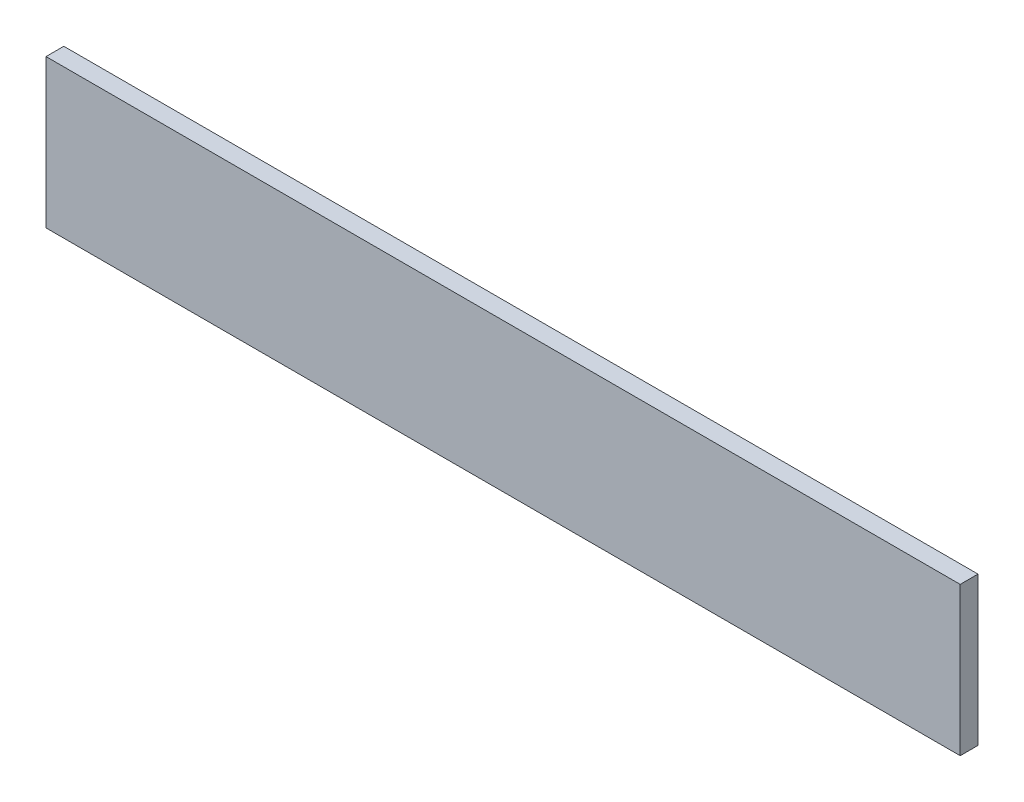
ISO-10303-21;
HEADER;
FILE_DESCRIPTION(('STEP AP214'),'2;1');
FILE_NAME('part.step','',(''),(''),'','','');
FILE_SCHEMA(('AUTOMOTIVE_DESIGN { 1 0 10303 214 1 1 1 1 }'));
ENDSEC;
DATA;
#1=APPLICATION_CONTEXT('core data for automotive mechanical design processes');
#2=APPLICATION_PROTOCOL_DEFINITION('international standard','automotive_design',2000,#1);
#3=PRODUCT_CONTEXT('',#1,'mechanical');
#4=PRODUCT('Part','Part','',(#3));
#5=PRODUCT_RELATED_PRODUCT_CATEGORY('part','',(#4));
#6=PRODUCT_DEFINITION_FORMATION('','',#4);
#7=PRODUCT_DEFINITION_CONTEXT('part definition',#1,'design');
#8=PRODUCT_DEFINITION('design','',#6,#7);
#9=PRODUCT_DEFINITION_SHAPE('','',#8);
#10=(LENGTH_UNIT() NAMED_UNIT(*) SI_UNIT(.MILLI.,.METRE.));
#11=(NAMED_UNIT(*) PLANE_ANGLE_UNIT() SI_UNIT($,.RADIAN.));
#12=(NAMED_UNIT(*) SI_UNIT($,.STERADIAN.) SOLID_ANGLE_UNIT());
#13=UNCERTAINTY_MEASURE_WITH_UNIT(LENGTH_MEASURE(1.E-05),#10,'distance_accuracy_value','');
#14=(GEOMETRIC_REPRESENTATION_CONTEXT(3) GLOBAL_UNCERTAINTY_ASSIGNED_CONTEXT((#13)) GLOBAL_UNIT_ASSIGNED_CONTEXT((#10,
#11,#12)) REPRESENTATION_CONTEXT('',''));
#15=CARTESIAN_POINT('',(0.,0.,0.));
#16=DIRECTION('',(0.,0.,1.));
#17=DIRECTION('',(1.,0.,0.));
#18=AXIS2_PLACEMENT_3D('',#15,#16,#17);
#19=CARTESIAN_POINT('',(0.,0.,3.));
#20=DIRECTION('',(1.,0.,0.));
#21=DIRECTION('',(0.,0.,-1.));
#22=AXIS2_PLACEMENT_3D('',#19,#20,#21);
#23=PLANE('',#22);
#24=DIRECTION('',(0.,-1.,0.));
#25=VECTOR('',#24,1.);
#26=CARTESIAN_POINT('',(0.,0.,0.));
#27=LINE('',#26,#25);
#28=CARTESIAN_POINT('',(0.,25.,0.));
#29=VERTEX_POINT('',#28);
#30=CARTESIAN_POINT('',(0.,0.,0.));
#31=VERTEX_POINT('',#30);
#32=EDGE_CURVE('E105',#29,#31,#27,.T.);
#33=ORIENTED_EDGE('',*,*,#32,.T.);
#34=DIRECTION('',(0.,0.,-1.));
#35=VECTOR('',#34,1.);
#36=CARTESIAN_POINT('',(0.,0.,3.));
#37=LINE('',#36,#35);
#38=CARTESIAN_POINT('',(0.,0.,3.));
#39=VERTEX_POINT('',#38);
#40=EDGE_CURVE('E11',#39,#31,#37,.T.);
#41=ORIENTED_EDGE('',*,*,#40,.F.);
#42=DIRECTION('',(0.,-1.,0.));
#43=VECTOR('',#42,1.);
#44=CARTESIAN_POINT('',(0.,0.,3.));
#45=LINE('',#44,#43);
#46=CARTESIAN_POINT('',(0.,25.,3.));
#47=VERTEX_POINT('',#46);
#48=EDGE_CURVE('E89',#47,#39,#45,.T.);
#49=ORIENTED_EDGE('',*,*,#48,.F.);
#50=DIRECTION('',(0.,0.,-1.));
#51=VECTOR('',#50,1.);
#52=CARTESIAN_POINT('',(0.,25.,3.));
#53=LINE('',#52,#51);
#54=EDGE_CURVE('E97',#47,#29,#53,.T.);
#55=ORIENTED_EDGE('',*,*,#54,.T.);
#56=EDGE_LOOP('',(#33,#41,#49,#55));
#57=FACE_BOUND('',#56,.T.);
#58=ADVANCED_FACE('F39',(#57),#23,.F.);
#59=CARTESIAN_POINT('',(0.,0.,3.));
#60=DIRECTION('',(0.,1.,0.));
#61=DIRECTION('',(0.,0.,1.));
#62=AXIS2_PLACEMENT_3D('',#59,#60,#61);
#63=PLANE('',#62);
#64=DIRECTION('',(1.,0.,0.));
#65=VECTOR('',#64,1.);
#66=CARTESIAN_POINT('',(0.,0.,0.));
#67=LINE('',#66,#65);
#68=CARTESIAN_POINT('',(154.,0.,0.));
#69=VERTEX_POINT('',#68);
#70=EDGE_CURVE('E92',#31,#69,#67,.T.);
#71=ORIENTED_EDGE('',*,*,#70,.T.);
#72=DIRECTION('',(0.,0.,-1.));
#73=VECTOR('',#72,1.);
#74=CARTESIAN_POINT('',(154.,0.,3.));
#75=LINE('',#74,#73);
#76=CARTESIAN_POINT('',(154.,0.,3.));
#77=VERTEX_POINT('',#76);
#78=EDGE_CURVE('E50',#77,#69,#75,.T.);
#79=ORIENTED_EDGE('',*,*,#78,.F.);
#80=DIRECTION('',(1.,0.,0.));
#81=VECTOR('',#80,1.);
#82=CARTESIAN_POINT('',(0.,0.,3.));
#83=LINE('',#82,#81);
#84=EDGE_CURVE('E82',#39,#77,#83,.T.);
#85=ORIENTED_EDGE('',*,*,#84,.F.);
#86=ORIENTED_EDGE('',*,*,#40,.T.);
#87=EDGE_LOOP('',(#71,#79,#85,#86));
#88=FACE_BOUND('',#87,.T.);
#89=ADVANCED_FACE('F93',(#88),#63,.F.);
#90=CARTESIAN_POINT('',(154.,0.,3.));
#91=DIRECTION('',(-1.,0.,0.));
#92=DIRECTION('',(0.,0.,1.));
#93=AXIS2_PLACEMENT_3D('',#90,#91,#92);
#94=PLANE('',#93);
#95=DIRECTION('',(0.,1.,0.));
#96=VECTOR('',#95,1.);
#97=CARTESIAN_POINT('',(154.,0.,0.));
#98=LINE('',#97,#96);
#99=CARTESIAN_POINT('',(154.,25.,0.));
#100=VERTEX_POINT('',#99);
#101=EDGE_CURVE('E72',#69,#100,#98,.T.);
#102=ORIENTED_EDGE('',*,*,#101,.T.);
#103=DIRECTION('',(0.,0.,-1.));
#104=VECTOR('',#103,1.);
#105=CARTESIAN_POINT('',(154.,25.,3.));
#106=LINE('',#105,#104);
#107=CARTESIAN_POINT('',(154.,25.,3.));
#108=VERTEX_POINT('',#107);
#109=EDGE_CURVE('E94',#108,#100,#106,.T.);
#110=ORIENTED_EDGE('',*,*,#109,.F.);
#111=DIRECTION('',(0.,1.,0.));
#112=VECTOR('',#111,1.);
#113=CARTESIAN_POINT('',(154.,0.,3.));
#114=LINE('',#113,#112);
#115=EDGE_CURVE('E88',#77,#108,#114,.T.);
#116=ORIENTED_EDGE('',*,*,#115,.F.);
#117=ORIENTED_EDGE('',*,*,#78,.T.);
#118=EDGE_LOOP('',(#102,#110,#116,#117));
#119=FACE_BOUND('',#118,.T.);
#120=ADVANCED_FACE('F96',(#119),#94,.F.);
#121=CARTESIAN_POINT('',(0.,25.,3.));
#122=DIRECTION('',(0.,-1.,0.));
#123=DIRECTION('',(0.,0.,-1.));
#124=AXIS2_PLACEMENT_3D('',#121,#122,#123);
#125=PLANE('',#124);
#126=DIRECTION('',(-1.,0.,0.));
#127=VECTOR('',#126,1.);
#128=CARTESIAN_POINT('',(0.,25.,0.));
#129=LINE('',#128,#127);
#130=EDGE_CURVE('E76',#100,#29,#129,.T.);
#131=ORIENTED_EDGE('',*,*,#130,.T.);
#132=ORIENTED_EDGE('',*,*,#54,.F.);
#133=DIRECTION('',(-1.,0.,0.));
#134=VECTOR('',#133,1.);
#135=CARTESIAN_POINT('',(0.,25.,3.));
#136=LINE('',#135,#134);
#137=EDGE_CURVE('E54',#108,#47,#136,.T.);
#138=ORIENTED_EDGE('',*,*,#137,.F.);
#139=ORIENTED_EDGE('',*,*,#109,.T.);
#140=EDGE_LOOP('',(#131,#132,#138,#139));
#141=FACE_BOUND('',#140,.T.);
#142=ADVANCED_FACE('F108',(#141),#125,.F.);
#143=CARTESIAN_POINT('',(0.,0.,3.));
#144=DIRECTION('',(0.,0.,-1.));
#145=DIRECTION('',(-1.,0.,0.));
#146=AXIS2_PLACEMENT_3D('',#143,#144,#145);
#147=PLANE('',#146);
#148=ORIENTED_EDGE('',*,*,#48,.T.);
#149=ORIENTED_EDGE('',*,*,#84,.T.);
#150=ORIENTED_EDGE('',*,*,#115,.T.);
#151=ORIENTED_EDGE('',*,*,#137,.T.);
#152=EDGE_LOOP('',(#148,#149,#150,#151));
#153=FACE_BOUND('',#152,.T.);
#154=ADVANCED_FACE('F86',(#153),#147,.F.);
#155=CARTESIAN_POINT('',(0.,0.,0.));
#156=DIRECTION('',(0.,0.,-1.));
#157=DIRECTION('',(-1.,0.,0.));
#158=AXIS2_PLACEMENT_3D('',#155,#156,#157);
#159=PLANE('',#158);
#160=ORIENTED_EDGE('',*,*,#32,.F.);
#161=ORIENTED_EDGE('',*,*,#130,.F.);
#162=ORIENTED_EDGE('',*,*,#101,.F.);
#163=ORIENTED_EDGE('',*,*,#70,.F.);
#164=EDGE_LOOP('',(#160,#161,#162,#163));
#165=FACE_BOUND('',#164,.T.);
#166=ADVANCED_FACE('F115',(#165),#159,.T.);
#167=CLOSED_SHELL('',(#58,#89,#120,#142,#154,#166));
#168=MANIFOLD_SOLID_BREP('B2',#167);
#169=ADVANCED_BREP_SHAPE_REPRESENTATION('',(#18,#168),#14);
#170=SHAPE_DEFINITION_REPRESENTATION(#9,#169);
ENDSEC;
END-ISO-10303-21;
